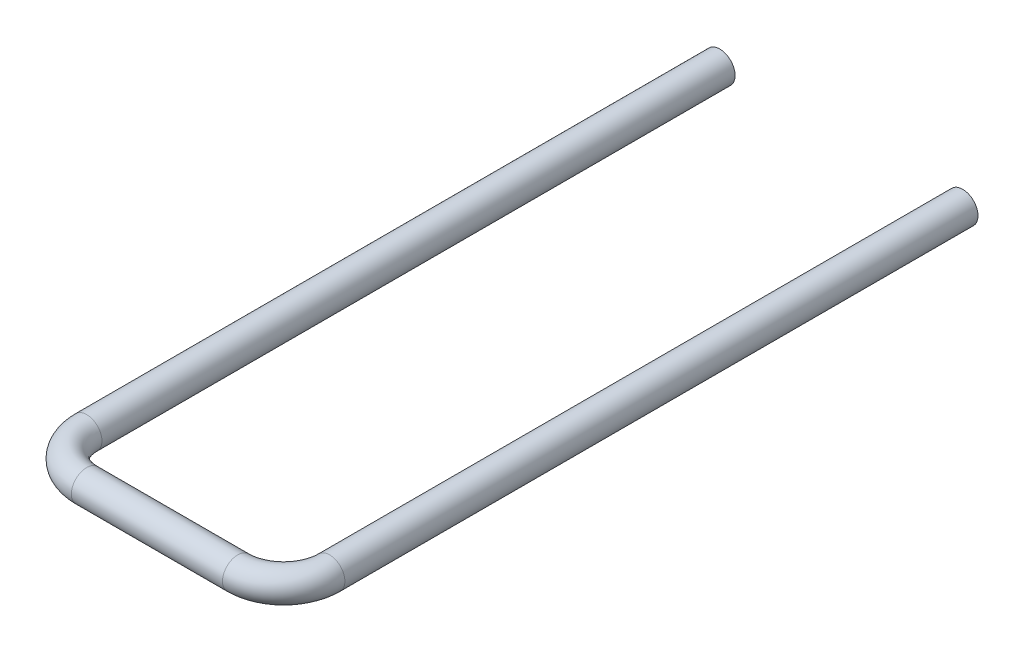
ISO-10303-21;
HEADER;
FILE_DESCRIPTION(('STEP AP214'),'2;1');
FILE_NAME('part.step','',(''),(''),'','','');
FILE_SCHEMA(('AUTOMOTIVE_DESIGN { 1 0 10303 214 1 1 1 1 }'));
ENDSEC;
DATA;
#1=APPLICATION_CONTEXT('core data for automotive mechanical design processes');
#2=APPLICATION_PROTOCOL_DEFINITION('international standard','automotive_design',2000,#1);
#3=PRODUCT_CONTEXT('',#1,'mechanical');
#4=PRODUCT('Part','Part','',(#3));
#5=PRODUCT_RELATED_PRODUCT_CATEGORY('part','',(#4));
#6=PRODUCT_DEFINITION_FORMATION('','',#4);
#7=PRODUCT_DEFINITION_CONTEXT('part definition',#1,'design');
#8=PRODUCT_DEFINITION('design','',#6,#7);
#9=PRODUCT_DEFINITION_SHAPE('','',#8);
#10=(LENGTH_UNIT() NAMED_UNIT(*) SI_UNIT(.MILLI.,.METRE.));
#11=(NAMED_UNIT(*) PLANE_ANGLE_UNIT() SI_UNIT($,.RADIAN.));
#12=(NAMED_UNIT(*) SI_UNIT($,.STERADIAN.) SOLID_ANGLE_UNIT());
#13=UNCERTAINTY_MEASURE_WITH_UNIT(LENGTH_MEASURE(1.E-05),#10,'distance_accuracy_value','');
#14=(GEOMETRIC_REPRESENTATION_CONTEXT(3) GLOBAL_UNCERTAINTY_ASSIGNED_CONTEXT((#13)) GLOBAL_UNIT_ASSIGNED_CONTEXT((#10,
#11,#12)) REPRESENTATION_CONTEXT('',''));
#15=CARTESIAN_POINT('',(0.,0.,0.));
#16=DIRECTION('',(0.,0.,1.));
#17=DIRECTION('',(1.,0.,0.));
#18=AXIS2_PLACEMENT_3D('',#15,#16,#17);
#19=CARTESIAN_POINT('',(0.,0.,0.));
#20=DIRECTION('',(0.,0.,1.));
#21=DIRECTION('',(1.,0.,0.));
#22=AXIS2_PLACEMENT_3D('',#19,#20,#21);
#23=PLANE('',#22);
#24=CARTESIAN_POINT('',(0.,0.,0.));
#25=DIRECTION('',(0.,0.,1.));
#26=DIRECTION('',(1.,0.,0.));
#27=AXIS2_PLACEMENT_3D('',#24,#25,#26);
#28=CIRCLE('',#27,0.4);
#29=CARTESIAN_POINT('',(0.4,0.,0.));
#30=VERTEX_POINT('',#29);
#31=EDGE_CURVE('E17',#30,#30,#28,.T.);
#32=ORIENTED_EDGE('',*,*,#31,.F.);
#33=EDGE_LOOP('',(#32));
#34=FACE_BOUND('',#33,.T.);
#35=ADVANCED_FACE('F14',(#34),#23,.F.);
#36=CARTESIAN_POINT('',(0.,0.,0.));
#37=DIRECTION('',(0.,0.,1.));
#38=DIRECTION('',(1.,0.,0.));
#39=AXIS2_PLACEMENT_3D('',#36,#37,#38);
#40=CYLINDRICAL_SURFACE('',#39,0.4);
#41=ORIENTED_EDGE('',*,*,#31,.T.);
#42=EDGE_LOOP('',(#41));
#43=FACE_BOUND('',#42,.T.);
#44=CARTESIAN_POINT('',(0.,0.,16.55));
#45=DIRECTION('',(0.,0.,1.));
#46=DIRECTION('',(1.,0.,0.));
#47=AXIS2_PLACEMENT_3D('',#44,#45,#46);
#48=CIRCLE('',#47,0.400000000000001);
#49=CARTESIAN_POINT('',(0.400000000000001,0.,16.55));
#50=VERTEX_POINT('',#49);
#51=EDGE_CURVE('E58',#50,#50,#48,.T.);
#52=ORIENTED_EDGE('',*,*,#51,.F.);
#53=EDGE_LOOP('',(#52));
#54=FACE_BOUND('',#53,.T.);
#55=ADVANCED_FACE('F51',(#43,#54),#40,.T.);
#56=CARTESIAN_POINT('',(-1.2,0.,16.55));
#57=DIRECTION('',(0.,-1.,0.));
#58=DIRECTION('',(0.,0.,-1.));
#59=AXIS2_PLACEMENT_3D('',#56,#57,#58);
#60=TOROIDAL_SURFACE('',#59,1.2,0.400000000000001);
#61=ORIENTED_EDGE('',*,*,#51,.T.);
#62=EDGE_LOOP('',(#61));
#63=FACE_BOUND('',#62,.T.);
#64=CARTESIAN_POINT('',(-1.2,0.,17.75));
#65=DIRECTION('',(-1.,0.,0.));
#66=DIRECTION('',(0.,0.,1.));
#67=AXIS2_PLACEMENT_3D('',#64,#65,#66);
#68=CIRCLE('',#67,0.4);
#69=CARTESIAN_POINT('',(-1.2,0.,18.15));
#70=VERTEX_POINT('',#69);
#71=EDGE_CURVE('E61',#70,#70,#68,.T.);
#72=ORIENTED_EDGE('',*,*,#71,.F.);
#73=EDGE_LOOP('',(#72));
#74=FACE_BOUND('',#73,.T.);
#75=ADVANCED_FACE('F47',(#63,#74),#60,.T.);
#76=CARTESIAN_POINT('',(16.6066370614359,0.,17.75));
#77=DIRECTION('',(-1.,0.,0.));
#78=DIRECTION('',(0.,0.,1.));
#79=AXIS2_PLACEMENT_3D('',#76,#77,#78);
#80=CYLINDRICAL_SURFACE('',#79,0.4);
#81=ORIENTED_EDGE('',*,*,#71,.T.);
#82=EDGE_LOOP('',(#81));
#83=FACE_BOUND('',#82,.T.);
#84=CARTESIAN_POINT('',(-5.15036293856409,0.,17.75));
#85=DIRECTION('',(-1.,0.,0.));
#86=DIRECTION('',(0.,0.,1.));
#87=AXIS2_PLACEMENT_3D('',#84,#85,#86);
#88=CIRCLE('',#87,0.4);
#89=CARTESIAN_POINT('',(-5.15036293856409,0.,18.15));
#90=VERTEX_POINT('',#89);
#91=EDGE_CURVE('E26',#90,#90,#88,.T.);
#92=ORIENTED_EDGE('',*,*,#91,.F.);
#93=EDGE_LOOP('',(#92));
#94=FACE_BOUND('',#93,.T.);
#95=ADVANCED_FACE('F43',(#83,#94),#80,.T.);
#96=CARTESIAN_POINT('',(-6.35036293856409,0.,-0.000362938564064663));
#97=DIRECTION('',(0.,0.,-1.));
#98=DIRECTION('',(-1.,0.,0.));
#99=AXIS2_PLACEMENT_3D('',#96,#97,#98);
#100=PLANE('',#99);
#101=CARTESIAN_POINT('',(-6.3503629385641,0.,-0.000362938564063553));
#102=DIRECTION('',(0.,0.,-1.));
#103=DIRECTION('',(-1.,0.,0.));
#104=AXIS2_PLACEMENT_3D('',#101,#102,#103);
#105=CIRCLE('',#104,0.4);
#106=CARTESIAN_POINT('',(-6.7503629385641,0.,-0.000362938564063504));
#107=VERTEX_POINT('',#106);
#108=EDGE_CURVE('E21',#107,#107,#105,.F.);
#109=ORIENTED_EDGE('',*,*,#108,.F.);
#110=EDGE_LOOP('',(#109));
#111=FACE_BOUND('',#110,.T.);
#112=ADVANCED_FACE('F39',(#111),#100,.T.);
#113=CARTESIAN_POINT('',(-5.15036293856409,0.,16.55));
#114=DIRECTION('',(0.,-1.,0.));
#115=DIRECTION('',(1.,0.,0.));
#116=AXIS2_PLACEMENT_3D('',#113,#114,#115);
#117=TOROIDAL_SURFACE('',#116,1.2,0.4);
#118=ORIENTED_EDGE('',*,*,#91,.T.);
#119=EDGE_LOOP('',(#118));
#120=FACE_BOUND('',#119,.T.);
#121=CARTESIAN_POINT('',(-6.35036293856409,0.,16.55));
#122=DIRECTION('',(0.,0.,-1.));
#123=DIRECTION('',(-1.,0.,0.));
#124=AXIS2_PLACEMENT_3D('',#121,#122,#123);
#125=CIRCLE('',#124,0.4);
#126=CARTESIAN_POINT('',(-6.75036293856409,0.,16.55));
#127=VERTEX_POINT('',#126);
#128=EDGE_CURVE('E9',#127,#127,#125,.T.);
#129=ORIENTED_EDGE('',*,*,#128,.F.);
#130=EDGE_LOOP('',(#129));
#131=FACE_BOUND('',#130,.T.);
#132=ADVANCED_FACE('F34',(#120,#131),#117,.T.);
#133=CARTESIAN_POINT('',(-6.35036293856409,0.,39.5636370614359));
#134=DIRECTION('',(0.,0.,-1.));
#135=DIRECTION('',(-1.,0.,0.));
#136=AXIS2_PLACEMENT_3D('',#133,#134,#135);
#137=CYLINDRICAL_SURFACE('',#136,0.4);
#138=ORIENTED_EDGE('',*,*,#128,.T.);
#139=EDGE_LOOP('',(#138));
#140=FACE_BOUND('',#139,.T.);
#141=ORIENTED_EDGE('',*,*,#108,.T.);
#142=EDGE_LOOP('',(#141));
#143=FACE_BOUND('',#142,.T.);
#144=ADVANCED_FACE('F38',(#140,#143),#137,.T.);
#145=CLOSED_SHELL('',(#35,#55,#75,#95,#112,#132,#144));
#146=MANIFOLD_SOLID_BREP('B1',#145);
#147=ADVANCED_BREP_SHAPE_REPRESENTATION('',(#18,#146),#14);
#148=SHAPE_DEFINITION_REPRESENTATION(#9,#147);
ENDSEC;
END-ISO-10303-21;
